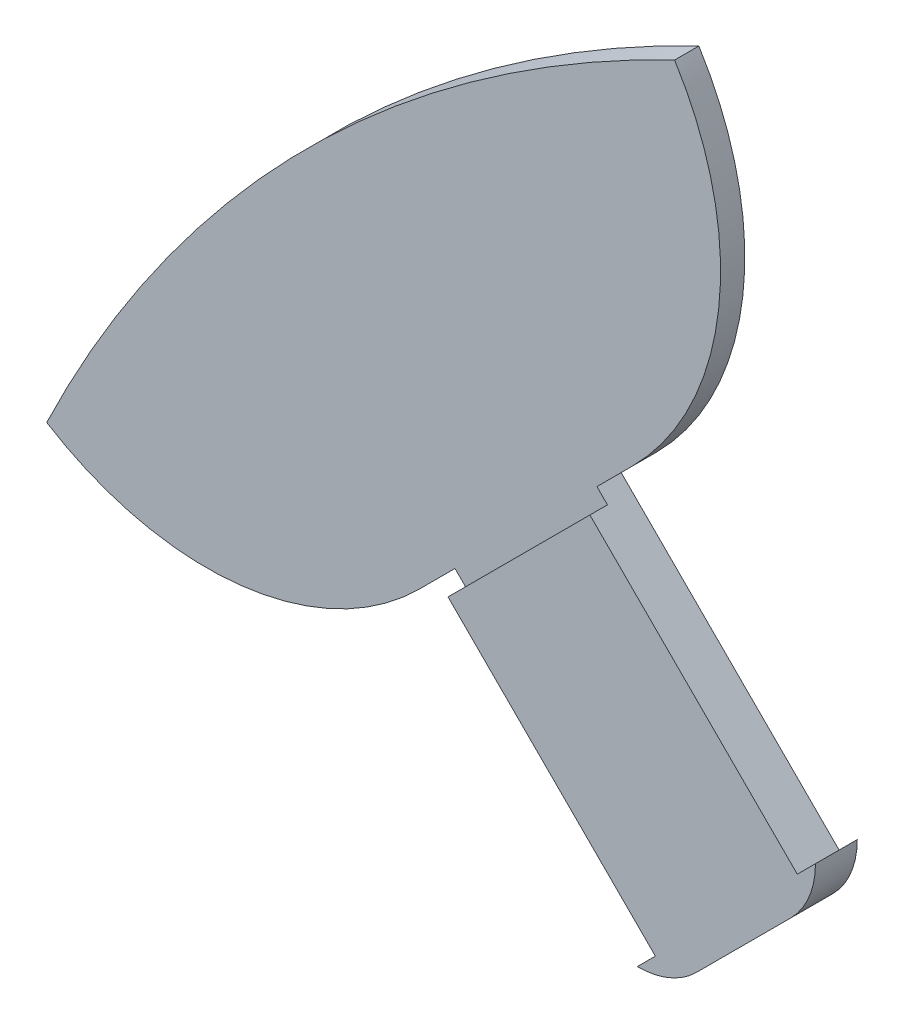
ISO-10303-21;
HEADER;
FILE_DESCRIPTION(('STEP AP214'),'2;1');
FILE_NAME('part.step','',(''),(''),'','','');
FILE_SCHEMA(('AUTOMOTIVE_DESIGN { 1 0 10303 214 1 1 1 1 }'));
ENDSEC;
DATA;
#1=APPLICATION_CONTEXT('core data for automotive mechanical design processes');
#2=APPLICATION_PROTOCOL_DEFINITION('international standard','automotive_design',2000,#1);
#3=PRODUCT_CONTEXT('',#1,'mechanical');
#4=PRODUCT('Part','Part','',(#3));
#5=PRODUCT_RELATED_PRODUCT_CATEGORY('part','',(#4));
#6=PRODUCT_DEFINITION_FORMATION('','',#4);
#7=PRODUCT_DEFINITION_CONTEXT('part definition',#1,'design');
#8=PRODUCT_DEFINITION('design','',#6,#7);
#9=PRODUCT_DEFINITION_SHAPE('','',#8);
#10=(LENGTH_UNIT() NAMED_UNIT(*) SI_UNIT(.MILLI.,.METRE.));
#11=(NAMED_UNIT(*) PLANE_ANGLE_UNIT() SI_UNIT($,.RADIAN.));
#12=(NAMED_UNIT(*) SI_UNIT($,.STERADIAN.) SOLID_ANGLE_UNIT());
#13=UNCERTAINTY_MEASURE_WITH_UNIT(LENGTH_MEASURE(1.E-05),#10,'distance_accuracy_value','');
#14=(GEOMETRIC_REPRESENTATION_CONTEXT(3) GLOBAL_UNCERTAINTY_ASSIGNED_CONTEXT((#13)) GLOBAL_UNIT_ASSIGNED_CONTEXT((#10,
#11,#12)) REPRESENTATION_CONTEXT('',''));
#15=CARTESIAN_POINT('',(0.,0.,0.));
#16=DIRECTION('',(0.,0.,1.));
#17=DIRECTION('',(1.,0.,0.));
#18=AXIS2_PLACEMENT_3D('',#15,#16,#17);
#19=CARTESIAN_POINT('',(-43.4815077525087,43.4815077525089,5.));
#20=DIRECTION('',(0.707106781186545,-0.70710678118655,0.));
#21=DIRECTION('',(0.70710678118655,0.707106781186545,0.));
#22=AXIS2_PLACEMENT_3D('',#19,#20,#21);
#23=PLANE('',#22);
#24=DIRECTION('',(0.,0.,-1.));
#25=VECTOR('',#24,1.);
#26=CARTESIAN_POINT('',(-37.1175467218298,49.8454687831878,5.));
#27=LINE('',#26,#25);
#28=CARTESIAN_POINT('',(-37.1175467218298,49.8454687831878,1.45));
#29=VERTEX_POINT('',#28);
#30=CARTESIAN_POINT('',(-37.1175467218298,49.8454687831878,0.));
#31=VERTEX_POINT('',#30);
#32=EDGE_CURVE('E154',#29,#31,#27,.T.);
#33=ORIENTED_EDGE('',*,*,#32,.F.);
#34=DIRECTION('',(-0.70710678118655,-0.707106781186545,0.));
#35=VECTOR('',#34,1.);
#36=CARTESIAN_POINT('',(-43.4815077525087,43.4815077525089,1.45));
#37=LINE('',#36,#35);
#38=CARTESIAN_POINT('',(-39.2388670653894,47.7241484396281,1.45));
#39=VERTEX_POINT('',#38);
#40=EDGE_CURVE('E211',#29,#39,#37,.T.);
#41=ORIENTED_EDGE('',*,*,#40,.T.);
#42=DIRECTION('',(0.,0.,-1.));
#43=VECTOR('',#42,1.);
#44=CARTESIAN_POINT('',(-39.2388670653894,47.7241484396281,5.));
#45=LINE('',#44,#43);
#46=CARTESIAN_POINT('',(-39.2388670653894,47.7241484396281,0.));
#47=VERTEX_POINT('',#46);
#48=EDGE_CURVE('E152',#39,#47,#45,.T.);
#49=ORIENTED_EDGE('',*,*,#48,.T.);
#50=DIRECTION('',(-0.70710678118655,-0.707106781186545,0.));
#51=VECTOR('',#50,1.);
#52=CARTESIAN_POINT('',(-43.4815077525087,43.4815077525089,0.));
#53=LINE('',#52,#51);
#54=EDGE_CURVE('E202',#31,#47,#53,.T.);
#55=ORIENTED_EDGE('',*,*,#54,.F.);
#56=EDGE_LOOP('',(#33,#41,#49,#55));
#57=FACE_BOUND('',#56,.T.);
#58=ADVANCED_FACE('F39',(#57),#23,.T.);
#59=CARTESIAN_POINT('',(-49.8454687831876,62.5733908445456,5.));
#60=DIRECTION('',(0.,0.,-1.));
#61=DIRECTION('',(-1.,0.,0.));
#62=AXIS2_PLACEMENT_3D('',#59,#60,#61);
#63=CYLINDRICAL_SURFACE('',#62,18.);
#64=DIRECTION('',(0.,0.,-1.));
#65=VECTOR('',#64,1.);
#66=CARTESIAN_POINT('',(-34.5941198646809,72.1335349943983,5.));
#67=LINE('',#66,#65);
#68=CARTESIAN_POINT('',(-34.5941198646809,72.1335349943983,1.45));
#69=VERTEX_POINT('',#68);
#70=CARTESIAN_POINT('',(-34.5941198646809,72.1335349943983,0.));
#71=VERTEX_POINT('',#70);
#72=EDGE_CURVE('E158',#69,#71,#67,.T.);
#73=ORIENTED_EDGE('',*,*,#72,.F.);
#74=CARTESIAN_POINT('',(-49.8454687831876,62.5733908445456,1.45));
#75=DIRECTION('',(0.,0.,1.));
#76=DIRECTION('',(1.,0.,0.));
#77=AXIS2_PLACEMENT_3D('',#74,#75,#76);
#78=CIRCLE('',#77,18.);
#79=EDGE_CURVE('E214',#69,#29,#78,.F.);
#80=ORIENTED_EDGE('',*,*,#79,.T.);
#81=ORIENTED_EDGE('',*,*,#32,.T.);
#82=CARTESIAN_POINT('',(-49.8454687831876,62.5733908445456,0.));
#83=DIRECTION('',(0.,0.,1.));
#84=DIRECTION('',(1.,0.,0.));
#85=AXIS2_PLACEMENT_3D('',#82,#83,#84);
#86=CIRCLE('',#85,18.);
#87=EDGE_CURVE('E199',#71,#31,#86,.F.);
#88=ORIENTED_EDGE('',*,*,#87,.F.);
#89=EDGE_LOOP('',(#73,#80,#81,#88));
#90=FACE_BOUND('',#89,.T.);
#91=ADVANCED_FACE('F260',(#90),#63,.T.);
#92=CARTESIAN_POINT('',(-62.5733908445455,49.8454687831878,5.));
#93=DIRECTION('',(0.,0.,-1.));
#94=DIRECTION('',(-1.,0.,0.));
#95=AXIS2_PLACEMENT_3D('',#92,#93,#94);
#96=CYLINDRICAL_SURFACE('',#95,18.);
#97=DIRECTION('',(0.,0.,-1.));
#98=VECTOR('',#97,1.);
#99=CARTESIAN_POINT('',(-49.8454687831877,37.11754672183,5.));
#100=LINE('',#99,#98);
#101=CARTESIAN_POINT('',(-49.8454687831877,37.11754672183,1.45));
#102=VERTEX_POINT('',#101);
#103=CARTESIAN_POINT('',(-49.8454687831877,37.11754672183,0.));
#104=VERTEX_POINT('',#103);
#105=EDGE_CURVE('E162',#102,#104,#100,.T.);
#106=ORIENTED_EDGE('',*,*,#105,.F.);
#107=CARTESIAN_POINT('',(-62.5733908445455,49.8454687831878,1.45));
#108=DIRECTION('',(0.,0.,1.));
#109=DIRECTION('',(1.,0.,0.));
#110=AXIS2_PLACEMENT_3D('',#107,#108,#109);
#111=CIRCLE('',#110,18.);
#112=CARTESIAN_POINT('',(-72.1335349943983,34.5941198646812,1.44999999999999));
#113=VERTEX_POINT('',#112);
#114=EDGE_CURVE('E219',#102,#113,#111,.F.);
#115=ORIENTED_EDGE('',*,*,#114,.T.);
#116=DIRECTION('',(0.,0.,-1.));
#117=VECTOR('',#116,1.);
#118=CARTESIAN_POINT('',(-72.1335349943982,34.5941198646811,5.));
#119=LINE('',#118,#117);
#120=CARTESIAN_POINT('',(-72.1335349943982,34.5941198646811,0.));
#121=VERTEX_POINT('',#120);
#122=EDGE_CURVE('E160',#113,#121,#119,.T.);
#123=ORIENTED_EDGE('',*,*,#122,.T.);
#124=CARTESIAN_POINT('',(-62.5733908445455,49.8454687831878,0.));
#125=DIRECTION('',(0.,0.,1.));
#126=DIRECTION('',(1.,0.,0.));
#127=AXIS2_PLACEMENT_3D('',#124,#125,#126);
#128=CIRCLE('',#127,18.);
#129=EDGE_CURVE('E193',#104,#121,#128,.F.);
#130=ORIENTED_EDGE('',*,*,#129,.F.);
#131=EDGE_LOOP('',(#106,#115,#123,#130));
#132=FACE_BOUND('',#131,.T.);
#133=ADVANCED_FACE('F272',(#132),#96,.T.);
#134=DIRECTION('',(0.,0.,-1.));
#135=VECTOR('',#134,1.);
#136=CARTESIAN_POINT('',(-47.724148439628,39.2388670653896,5.));
#137=LINE('',#136,#135);
#138=CARTESIAN_POINT('',(-47.724148439628,39.2388670653896,1.45));
#139=VERTEX_POINT('',#138);
#140=CARTESIAN_POINT('',(-47.724148439628,39.2388670653896,0.));
#141=VERTEX_POINT('',#140);
#142=EDGE_CURVE('E164',#139,#141,#137,.T.);
#143=ORIENTED_EDGE('',*,*,#142,.F.);
#144=DIRECTION('',(-0.70710678118655,-0.707106781186545,0.));
#145=VECTOR('',#144,1.);
#146=CARTESIAN_POINT('',(-43.4815077525087,43.4815077525089,1.45));
#147=LINE('',#146,#145);
#148=EDGE_CURVE('E222',#139,#102,#147,.T.);
#149=ORIENTED_EDGE('',*,*,#148,.T.);
#150=ORIENTED_EDGE('',*,*,#105,.T.);
#151=EDGE_CURVE('E192',#141,#104,#53,.T.);
#152=ORIENTED_EDGE('',*,*,#151,.F.);
#153=EDGE_LOOP('',(#143,#149,#150,#152));
#154=FACE_BOUND('',#153,.T.);
#155=ADVANCED_FACE('F275',(#154),#23,.T.);
#156=CARTESIAN_POINT('',(4.24264068711934,4.24264068711934,5.));
#157=DIRECTION('',(0.707106781186548,0.707106781186548,0.));
#158=DIRECTION('',(-0.707106781186548,0.707106781186548,0.));
#159=AXIS2_PLACEMENT_3D('',#156,#157,#158);
#160=PLANE('',#159);
#161=DIRECTION('',(-0.707106781186548,0.707106781186548,0.));
#162=VECTOR('',#161,1.);
#163=CARTESIAN_POINT('',(4.24264068711934,4.24264068711934,2.5));
#164=LINE('',#163,#162);
#165=CARTESIAN_POINT('',(-26.2085353161738,34.6938166904125,2.5));
#166=VERTEX_POINT('',#165);
#167=CARTESIAN_POINT('',(-38.6080302527855,47.0933116270241,2.5));
#168=VERTEX_POINT('',#167);
#169=EDGE_CURVE('E54',#166,#168,#164,.T.);
#170=ORIENTED_EDGE('',*,*,#169,.F.);
#171=DIRECTION('',(0.,0.,-1.));
#172=VECTOR('',#171,1.);
#173=CARTESIAN_POINT('',(-26.2085353161738,34.6938166904125,5.));
#174=LINE('',#173,#172);
#175=CARTESIAN_POINT('',(-26.2085353161738,34.6938166904125,0.));
#176=VERTEX_POINT('',#175);
#177=EDGE_CURVE('E175',#166,#176,#174,.T.);
#178=ORIENTED_EDGE('',*,*,#177,.T.);
#179=DIRECTION('',(0.707106781186548,-0.707106781186548,0.));
#180=VECTOR('',#179,1.);
#181=CARTESIAN_POINT('',(4.24264068711934,4.24264068711934,0.));
#182=LINE('',#181,#180);
#183=EDGE_CURVE('E205',#47,#176,#182,.T.);
#184=ORIENTED_EDGE('',*,*,#183,.F.);
#185=ORIENTED_EDGE('',*,*,#48,.F.);
#186=DIRECTION('',(0.707106781186548,-0.707106781186548,0.));
#187=VECTOR('',#186,1.);
#188=CARTESIAN_POINT('',(4.24264068711934,4.24264068711934,1.45));
#189=LINE('',#188,#187);
#190=CARTESIAN_POINT('',(-38.6080302527855,47.0933116270241,1.45));
#191=VERTEX_POINT('',#190);
#192=EDGE_CURVE('E208',#39,#191,#189,.T.);
#193=ORIENTED_EDGE('',*,*,#192,.T.);
#194=DIRECTION('',(0.,0.,-1.));
#195=VECTOR('',#194,1.);
#196=CARTESIAN_POINT('',(-38.6080302527855,47.0933116270241,5.));
#197=LINE('',#196,#195);
#198=EDGE_CURVE('E225',#168,#191,#197,.T.);
#199=ORIENTED_EDGE('',*,*,#198,.F.);
#200=EDGE_LOOP('',(#170,#178,#184,#185,#193,#199));
#201=FACE_BOUND('',#200,.T.);
#202=ADVANCED_FACE('F41',(#201),#160,.T.);
#203=CARTESIAN_POINT('',(0.,0.,5.));
#204=DIRECTION('',(0.,0.,-1.));
#205=DIRECTION('',(-1.,0.,0.));
#206=AXIS2_PLACEMENT_3D('',#203,#204,#205);
#207=CYLINDRICAL_SURFACE('',#206,80.);
#208=ORIENTED_EDGE('',*,*,#122,.F.);
#209=CARTESIAN_POINT('',(0.,0.,1.45));
#210=DIRECTION('',(0.,0.,1.));
#211=DIRECTION('',(1.,0.,0.));
#212=AXIS2_PLACEMENT_3D('',#209,#210,#211);
#213=CIRCLE('',#212,80.);
#214=EDGE_CURVE('E217',#69,#113,#213,.T.);
#215=ORIENTED_EDGE('',*,*,#214,.F.);
#216=ORIENTED_EDGE('',*,*,#72,.T.);
#217=CARTESIAN_POINT('',(0.,0.,0.));
#218=DIRECTION('',(0.,0.,1.));
#219=DIRECTION('',(1.,0.,0.));
#220=AXIS2_PLACEMENT_3D('',#217,#218,#219);
#221=CIRCLE('',#220,80.);
#222=EDGE_CURVE('E196',#71,#121,#221,.T.);
#223=ORIENTED_EDGE('',*,*,#222,.T.);
#224=EDGE_LOOP('',(#208,#215,#216,#223));
#225=FACE_BOUND('',#224,.T.);
#226=ADVANCED_FACE('F265',(#225),#207,.T.);
#227=CARTESIAN_POINT('',(-4.2426406871192,-4.2426406871192,5.));
#228=DIRECTION('',(0.707106781186547,0.707106781186548,0.));
#229=DIRECTION('',(-0.707106781186548,0.707106781186547,0.));
#230=AXIS2_PLACEMENT_3D('',#227,#228,#229);
#231=PLANE('',#230);
#232=DIRECTION('',(0.,0.,-1.));
#233=VECTOR('',#232,1.);
#234=CARTESIAN_POINT('',(-34.6938166904123,26.2085353161739,5.));
#235=LINE('',#234,#233);
#236=CARTESIAN_POINT('',(-34.6938166904123,26.2085353161739,2.5));
#237=VERTEX_POINT('',#236);
#238=CARTESIAN_POINT('',(-34.6938166904123,26.2085353161739,0.));
#239=VERTEX_POINT('',#238);
#240=EDGE_CURVE('E146',#237,#239,#235,.T.);
#241=ORIENTED_EDGE('',*,*,#240,.F.);
#242=DIRECTION('',(-0.707106781186548,0.707106781186547,0.));
#243=VECTOR('',#242,1.);
#244=CARTESIAN_POINT('',(-4.2426406871192,-4.2426406871192,2.5));
#245=LINE('',#244,#243);
#246=CARTESIAN_POINT('',(-47.093311627024,38.6080302527856,2.5));
#247=VERTEX_POINT('',#246);
#248=EDGE_CURVE('E139',#237,#247,#245,.T.);
#249=ORIENTED_EDGE('',*,*,#248,.T.);
#250=DIRECTION('',(0.,0.,-1.));
#251=VECTOR('',#250,1.);
#252=CARTESIAN_POINT('',(-47.093311627024,38.6080302527856,5.));
#253=LINE('',#252,#251);
#254=CARTESIAN_POINT('',(-47.093311627024,38.6080302527856,1.44999999999999));
#255=VERTEX_POINT('',#254);
#256=EDGE_CURVE('E61',#247,#255,#253,.T.);
#257=ORIENTED_EDGE('',*,*,#256,.T.);
#258=DIRECTION('',(0.707106781186548,-0.707106781186547,0.));
#259=VECTOR('',#258,1.);
#260=CARTESIAN_POINT('',(-4.2426406871192,-4.2426406871192,1.45));
#261=LINE('',#260,#259);
#262=EDGE_CURVE('E47',#139,#255,#261,.T.);
#263=ORIENTED_EDGE('',*,*,#262,.F.);
#264=ORIENTED_EDGE('',*,*,#142,.T.);
#265=DIRECTION('',(0.707106781186548,-0.707106781186547,0.));
#266=VECTOR('',#265,1.);
#267=CARTESIAN_POINT('',(-4.2426406871192,-4.2426406871192,0.));
#268=LINE('',#267,#266);
#269=EDGE_CURVE('E190',#141,#239,#268,.T.);
#270=ORIENTED_EDGE('',*,*,#269,.T.);
#271=EDGE_LOOP('',(#241,#249,#257,#263,#264,#270));
#272=FACE_BOUND('',#271,.T.);
#273=ADVANCED_FACE('F144',(#272),#231,.F.);
#274=CARTESIAN_POINT('',(-30.4511760032931,30.4511760032932,5.));
#275=DIRECTION('',(-0.707106781186546,0.707106781186549,0.));
#276=DIRECTION('',(-0.707106781186549,-0.707106781186546,0.));
#277=AXIS2_PLACEMENT_3D('',#274,#275,#276);
#278=PLANE('',#277);
#279=DIRECTION('',(-0.707106781186549,-0.707106781186546,0.));
#280=VECTOR('',#279,1.);
#281=CARTESIAN_POINT('',(-30.4511760032931,30.4511760032932,2.5));
#282=LINE('',#281,#280);
#283=CARTESIAN_POINT('',(-35.7796031280393,25.122748878547,2.5));
#284=VERTEX_POINT('',#283);
#285=EDGE_CURVE('E228',#237,#284,#282,.T.);
#286=ORIENTED_EDGE('',*,*,#285,.F.);
#287=ORIENTED_EDGE('',*,*,#240,.T.);
#288=DIRECTION('',(0.707106781186549,0.707106781186546,0.));
#289=VECTOR('',#288,1.);
#290=CARTESIAN_POINT('',(-30.4511760032931,30.4511760032932,0.));
#291=LINE('',#290,#289);
#292=CARTESIAN_POINT('',(-35.7796031280393,25.122748878547,0.));
#293=VERTEX_POINT('',#292);
#294=EDGE_CURVE('E187',#293,#239,#291,.T.);
#295=ORIENTED_EDGE('',*,*,#294,.F.);
#296=DIRECTION('',(0.,0.,-1.));
#297=VECTOR('',#296,1.);
#298=CARTESIAN_POINT('',(-35.7796031280393,25.122748878547,5.));
#299=LINE('',#298,#297);
#300=EDGE_CURVE('E167',#284,#293,#299,.T.);
#301=ORIENTED_EDGE('',*,*,#300,.F.);
#302=EDGE_LOOP('',(#286,#287,#295,#301));
#303=FACE_BOUND('',#302,.T.);
#304=ADVANCED_FACE('F280',(#303),#278,.T.);
#305=CARTESIAN_POINT('',(-35.7796031280392,30.122748878547,5.));
#306=DIRECTION('',(0.,0.,-1.));
#307=DIRECTION('',(-1.,0.,0.));
#308=AXIS2_PLACEMENT_3D('',#305,#306,#307);
#309=CYLINDRICAL_SURFACE('',#308,5.);
#310=CARTESIAN_POINT('',(-35.7796031280392,30.122748878547,2.5));
#311=DIRECTION('',(0.,0.,-1.));
#312=DIRECTION('',(-1.,0.,0.));
#313=AXIS2_PLACEMENT_3D('',#310,#311,#312);
#314=CIRCLE('',#313,5.);
#315=CARTESIAN_POINT('',(-32.2440692221065,26.5872149726143,2.5));
#316=VERTEX_POINT('',#315);
#317=EDGE_CURVE('E230',#284,#316,#314,.F.);
#318=ORIENTED_EDGE('',*,*,#317,.F.);
#319=ORIENTED_EDGE('',*,*,#300,.T.);
#320=CARTESIAN_POINT('',(-35.7796031280392,30.122748878547,0.));
#321=DIRECTION('',(0.,0.,1.));
#322=DIRECTION('',(1.,0.,0.));
#323=AXIS2_PLACEMENT_3D('',#320,#321,#322);
#324=CIRCLE('',#323,5.);
#325=CARTESIAN_POINT('',(-32.2440692221065,26.5872149726143,0.));
#326=VERTEX_POINT('',#325);
#327=EDGE_CURVE('E184',#326,#293,#324,.F.);
#328=ORIENTED_EDGE('',*,*,#327,.F.);
#329=DIRECTION('',(0.,0.,-1.));
#330=VECTOR('',#329,1.);
#331=CARTESIAN_POINT('',(-32.2440692221065,26.5872149726143,5.));
#332=LINE('',#331,#330);
#333=EDGE_CURVE('E169',#316,#326,#332,.T.);
#334=ORIENTED_EDGE('',*,*,#333,.F.);
#335=EDGE_LOOP('',(#318,#319,#328,#334));
#336=FACE_BOUND('',#335,.T.);
#337=ADVANCED_FACE('F285',(#336),#309,.T.);
#338=CARTESIAN_POINT('',(-29.4156420973603,29.4156420973604,5.));
#339=DIRECTION('',(0.707106781186546,-0.707106781186549,0.));
#340=DIRECTION('',(0.707106781186549,0.707106781186546,0.));
#341=AXIS2_PLACEMENT_3D('',#338,#339,#340);
#342=PLANE('',#341);
#343=DIRECTION('',(0.707106781186549,0.707106781186546,0.));
#344=VECTOR('',#343,1.);
#345=CARTESIAN_POINT('',(-29.4156420973603,29.4156420973604,2.5));
#346=LINE('',#345,#344);
#347=CARTESIAN_POINT('',(-26.5872149726142,32.2440692221066,2.5));
#348=VERTEX_POINT('',#347);
#349=EDGE_CURVE('E232',#316,#348,#346,.T.);
#350=ORIENTED_EDGE('',*,*,#349,.F.);
#351=ORIENTED_EDGE('',*,*,#333,.T.);
#352=DIRECTION('',(-0.707106781186549,-0.707106781186546,0.));
#353=VECTOR('',#352,1.);
#354=CARTESIAN_POINT('',(-29.4156420973603,29.4156420973604,0.));
#355=LINE('',#354,#353);
#356=CARTESIAN_POINT('',(-26.5872149726142,32.2440692221066,0.));
#357=VERTEX_POINT('',#356);
#358=EDGE_CURVE('E181',#357,#326,#355,.T.);
#359=ORIENTED_EDGE('',*,*,#358,.F.);
#360=DIRECTION('',(0.,0.,-1.));
#361=VECTOR('',#360,1.);
#362=CARTESIAN_POINT('',(-26.5872149726142,32.2440692221066,5.));
#363=LINE('',#362,#361);
#364=EDGE_CURVE('E171',#348,#357,#363,.T.);
#365=ORIENTED_EDGE('',*,*,#364,.F.);
#366=EDGE_LOOP('',(#350,#351,#359,#365));
#367=FACE_BOUND('',#366,.T.);
#368=ADVANCED_FACE('F288',(#367),#342,.T.);
#369=CARTESIAN_POINT('',(-30.1227488785469,35.7796031280394,5.));
#370=DIRECTION('',(0.,0.,-1.));
#371=DIRECTION('',(-1.,0.,0.));
#372=AXIS2_PLACEMENT_3D('',#369,#370,#371);
#373=CYLINDRICAL_SURFACE('',#372,5.);
#374=CARTESIAN_POINT('',(-30.1227488785469,35.7796031280394,2.5));
#375=DIRECTION('',(0.,0.,-1.));
#376=DIRECTION('',(-1.,0.,0.));
#377=AXIS2_PLACEMENT_3D('',#374,#375,#376);
#378=CIRCLE('',#377,5.);
#379=CARTESIAN_POINT('',(-25.1227488785469,35.7796031280393,2.5));
#380=VERTEX_POINT('',#379);
#381=EDGE_CURVE('E234',#348,#380,#378,.F.);
#382=ORIENTED_EDGE('',*,*,#381,.F.);
#383=ORIENTED_EDGE('',*,*,#364,.T.);
#384=CARTESIAN_POINT('',(-30.1227488785469,35.7796031280394,0.));
#385=DIRECTION('',(0.,0.,1.));
#386=DIRECTION('',(1.,0.,0.));
#387=AXIS2_PLACEMENT_3D('',#384,#385,#386);
#388=CIRCLE('',#387,5.);
#389=CARTESIAN_POINT('',(-25.1227488785469,35.7796031280393,0.));
#390=VERTEX_POINT('',#389);
#391=EDGE_CURVE('E178',#390,#357,#388,.F.);
#392=ORIENTED_EDGE('',*,*,#391,.F.);
#393=DIRECTION('',(0.,0.,-1.));
#394=VECTOR('',#393,1.);
#395=CARTESIAN_POINT('',(-25.1227488785469,35.7796031280393,5.));
#396=LINE('',#395,#394);
#397=EDGE_CURVE('E173',#380,#390,#396,.T.);
#398=ORIENTED_EDGE('',*,*,#397,.F.);
#399=EDGE_LOOP('',(#382,#383,#392,#398));
#400=FACE_BOUND('',#399,.T.);
#401=ADVANCED_FACE('F291',(#400),#373,.T.);
#402=DIRECTION('',(-0.707106781186549,-0.707106781186546,0.));
#403=VECTOR('',#402,1.);
#404=CARTESIAN_POINT('',(-30.4511760032931,30.4511760032932,2.5));
#405=LINE('',#404,#403);
#406=EDGE_CURVE('E236',#380,#166,#405,.T.);
#407=ORIENTED_EDGE('',*,*,#406,.F.);
#408=ORIENTED_EDGE('',*,*,#397,.T.);
#409=EDGE_CURVE('E177',#176,#390,#291,.T.);
#410=ORIENTED_EDGE('',*,*,#409,.F.);
#411=ORIENTED_EDGE('',*,*,#177,.F.);
#412=EDGE_LOOP('',(#407,#408,#410,#411));
#413=FACE_BOUND('',#412,.T.);
#414=ADVANCED_FACE('F246',(#413),#278,.T.);
#415=CARTESIAN_POINT('',(0.,0.,0.));
#416=DIRECTION('',(0.,0.,1.));
#417=DIRECTION('',(1.,0.,0.));
#418=AXIS2_PLACEMENT_3D('',#415,#416,#417);
#419=PLANE('',#418);
#420=ORIENTED_EDGE('',*,*,#183,.T.);
#421=ORIENTED_EDGE('',*,*,#409,.T.);
#422=ORIENTED_EDGE('',*,*,#391,.T.);
#423=ORIENTED_EDGE('',*,*,#358,.T.);
#424=ORIENTED_EDGE('',*,*,#327,.T.);
#425=ORIENTED_EDGE('',*,*,#294,.T.);
#426=ORIENTED_EDGE('',*,*,#269,.F.);
#427=ORIENTED_EDGE('',*,*,#151,.T.);
#428=ORIENTED_EDGE('',*,*,#129,.T.);
#429=ORIENTED_EDGE('',*,*,#222,.F.);
#430=ORIENTED_EDGE('',*,*,#87,.T.);
#431=ORIENTED_EDGE('',*,*,#54,.T.);
#432=EDGE_LOOP('',(#420,#421,#422,#423,#424,#425,#426,#427,#428,#429,#430,#431));
#433=FACE_BOUND('',#432,.T.);
#434=ADVANCED_FACE('F250',(#433),#419,.F.);
#435=CARTESIAN_POINT('',(-42.8506709399047,42.8506709399049,1.45));
#436=DIRECTION('',(0.,0.,1.));
#437=DIRECTION('',(1.,0.,0.));
#438=AXIS2_PLACEMENT_3D('',#435,#436,#437);
#439=PLANE('',#438);
#440=ORIENTED_EDGE('',*,*,#40,.F.);
#441=ORIENTED_EDGE('',*,*,#79,.F.);
#442=ORIENTED_EDGE('',*,*,#214,.T.);
#443=ORIENTED_EDGE('',*,*,#114,.F.);
#444=ORIENTED_EDGE('',*,*,#148,.F.);
#445=ORIENTED_EDGE('',*,*,#262,.T.);
#446=DIRECTION('',(0.707106781186549,0.707106781186546,0.));
#447=VECTOR('',#446,1.);
#448=CARTESIAN_POINT('',(-42.8506709399047,42.8506709399049,1.45));
#449=LINE('',#448,#447);
#450=EDGE_CURVE('E150',#255,#191,#449,.T.);
#451=ORIENTED_EDGE('',*,*,#450,.T.);
#452=ORIENTED_EDGE('',*,*,#192,.F.);
#453=EDGE_LOOP('',(#440,#441,#442,#443,#444,#445,#451,#452));
#454=FACE_BOUND('',#453,.T.);
#455=ADVANCED_FACE('F256',(#454),#439,.T.);
#456=CARTESIAN_POINT('',(-42.8506709399047,42.8506709399049,0.));
#457=DIRECTION('',(0.707106781186546,-0.707106781186549,0.));
#458=DIRECTION('',(0.707106781186549,0.707106781186546,0.));
#459=AXIS2_PLACEMENT_3D('',#456,#457,#458);
#460=PLANE('',#459);
#461=ORIENTED_EDGE('',*,*,#256,.F.);
#462=DIRECTION('',(0.707106781186549,0.707106781186546,0.));
#463=VECTOR('',#462,1.);
#464=CARTESIAN_POINT('',(-42.8506709399047,42.8506709399049,2.5));
#465=LINE('',#464,#463);
#466=EDGE_CURVE('E11',#247,#168,#465,.T.);
#467=ORIENTED_EDGE('',*,*,#466,.T.);
#468=ORIENTED_EDGE('',*,*,#198,.T.);
#469=ORIENTED_EDGE('',*,*,#450,.F.);
#470=EDGE_LOOP('',(#461,#467,#468,#469));
#471=FACE_BOUND('',#470,.T.);
#472=ADVANCED_FACE('F148',(#471),#460,.F.);
#473=CARTESIAN_POINT('',(-20.9303607231218,20.9303607231219,2.5));
#474=DIRECTION('',(0.,0.,-1.));
#475=DIRECTION('',(-1.,0.,0.));
#476=AXIS2_PLACEMENT_3D('',#473,#474,#475);
#477=PLANE('',#476);
#478=ORIENTED_EDGE('',*,*,#285,.T.);
#479=ORIENTED_EDGE('',*,*,#317,.T.);
#480=ORIENTED_EDGE('',*,*,#349,.T.);
#481=ORIENTED_EDGE('',*,*,#381,.T.);
#482=ORIENTED_EDGE('',*,*,#406,.T.);
#483=ORIENTED_EDGE('',*,*,#169,.T.);
#484=ORIENTED_EDGE('',*,*,#466,.F.);
#485=ORIENTED_EDGE('',*,*,#248,.F.);
#486=EDGE_LOOP('',(#478,#479,#480,#481,#482,#483,#484,#485));
#487=FACE_BOUND('',#486,.T.);
#488=ADVANCED_FACE('F138',(#487),#477,.F.);
#489=CLOSED_SHELL('',(#58,#91,#133,#155,#202,#226,#273,#304,#337,#368,#401,#414,#434,#455,#472,#488));
#490=MANIFOLD_SOLID_BREP('B2',#489);
#491=ADVANCED_BREP_SHAPE_REPRESENTATION('',(#18,#490),#14);
#492=SHAPE_DEFINITION_REPRESENTATION(#9,#491);
ENDSEC;
END-ISO-10303-21;
